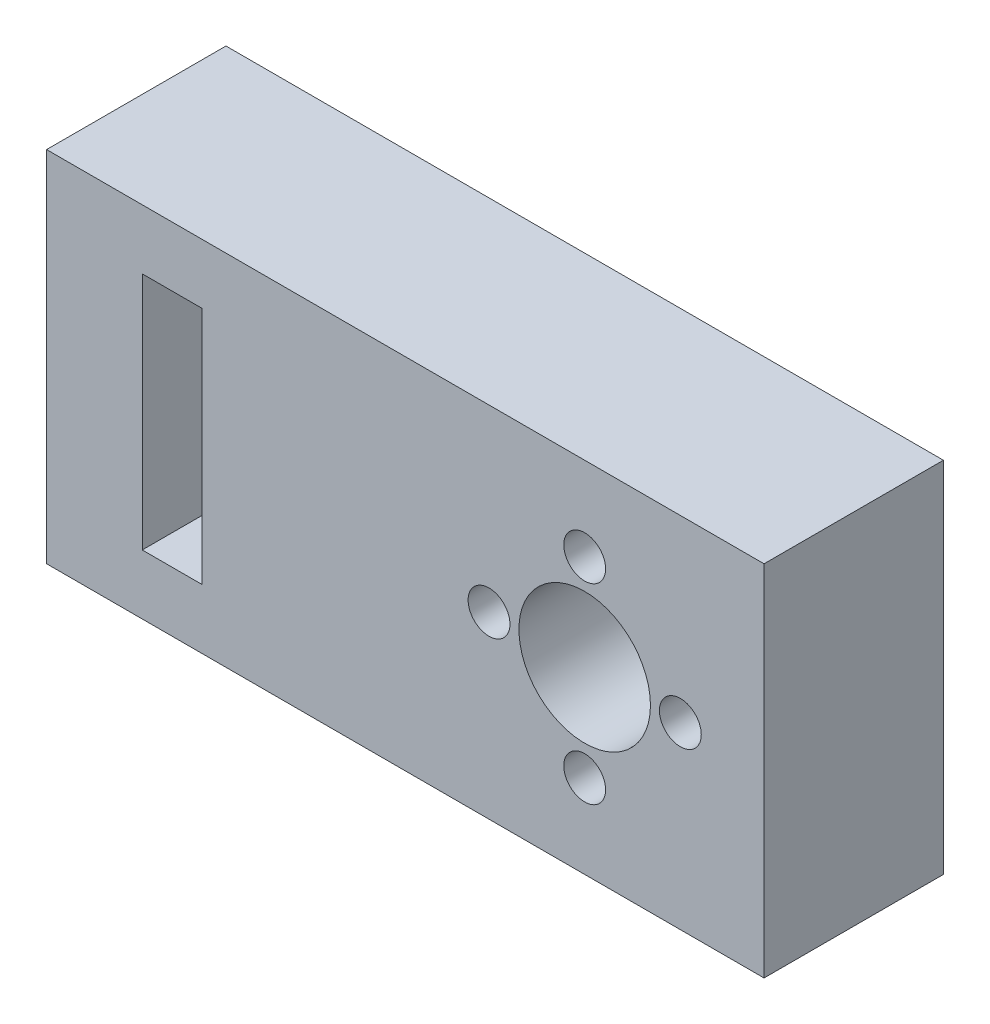
ISO-10303-21;
HEADER;
FILE_DESCRIPTION(('STEP AP214'),'2;1');
FILE_NAME('part.step','',(''),(''),'','','');
FILE_SCHEMA(('AUTOMOTIVE_DESIGN { 1 0 10303 214 1 1 1 1 }'));
ENDSEC;
DATA;
#1=APPLICATION_CONTEXT('core data for automotive mechanical design processes');
#2=APPLICATION_PROTOCOL_DEFINITION('international standard','automotive_design',2000,#1);
#3=PRODUCT_CONTEXT('',#1,'mechanical');
#4=PRODUCT('Part','Part','',(#3));
#5=PRODUCT_RELATED_PRODUCT_CATEGORY('part','',(#4));
#6=PRODUCT_DEFINITION_FORMATION('','',#4);
#7=PRODUCT_DEFINITION_CONTEXT('part definition',#1,'design');
#8=PRODUCT_DEFINITION('design','',#6,#7);
#9=PRODUCT_DEFINITION_SHAPE('','',#8);
#10=(LENGTH_UNIT() NAMED_UNIT(*) SI_UNIT(.MILLI.,.METRE.));
#11=(NAMED_UNIT(*) PLANE_ANGLE_UNIT() SI_UNIT($,.RADIAN.));
#12=(NAMED_UNIT(*) SI_UNIT($,.STERADIAN.) SOLID_ANGLE_UNIT());
#13=UNCERTAINTY_MEASURE_WITH_UNIT(LENGTH_MEASURE(1.E-05),#10,'distance_accuracy_value','');
#14=(GEOMETRIC_REPRESENTATION_CONTEXT(3) GLOBAL_UNCERTAINTY_ASSIGNED_CONTEXT((#13)) GLOBAL_UNIT_ASSIGNED_CONTEXT((#10,
#11,#12)) REPRESENTATION_CONTEXT('',''));
#15=CARTESIAN_POINT('',(0.,0.,0.));
#16=DIRECTION('',(0.,0.,1.));
#17=DIRECTION('',(1.,0.,0.));
#18=AXIS2_PLACEMENT_3D('',#15,#16,#17);
#19=CARTESIAN_POINT('',(0.,0.,7.5));
#20=DIRECTION('',(0.,0.,1.));
#21=DIRECTION('',(1.,0.,0.));
#22=AXIS2_PLACEMENT_3D('',#19,#20,#21);
#23=PLANE('',#22);
#24=CARTESIAN_POINT('',(15.0000000000002,-8.,7.5));
#25=DIRECTION('',(0.,0.,1.));
#26=DIRECTION('',(1.,0.,0.));
#27=AXIS2_PLACEMENT_3D('',#24,#25,#26);
#28=CIRCLE('',#27,1.75);
#29=CARTESIAN_POINT('',(16.7500000000002,-8.,7.5));
#30=VERTEX_POINT('',#29);
#31=EDGE_CURVE('E274',#30,#30,#28,.T.);
#32=ORIENTED_EDGE('',*,*,#31,.F.);
#33=EDGE_LOOP('',(#32));
#34=FACE_BOUND('',#33,.T.);
#35=CARTESIAN_POINT('',(15.,8.,7.5));
#36=DIRECTION('',(0.,0.,1.));
#37=DIRECTION('',(1.,0.,0.));
#38=AXIS2_PLACEMENT_3D('',#35,#36,#37);
#39=CIRCLE('',#38,1.75);
#40=CARTESIAN_POINT('',(16.75,8.,7.5));
#41=VERTEX_POINT('',#40);
#42=EDGE_CURVE('E129',#41,#41,#39,.T.);
#43=ORIENTED_EDGE('',*,*,#42,.F.);
#44=EDGE_LOOP('',(#43));
#45=FACE_BOUND('',#44,.T.);
#46=CARTESIAN_POINT('',(15.,0.,7.5));
#47=DIRECTION('',(0.,0.,1.));
#48=DIRECTION('',(1.,0.,0.));
#49=AXIS2_PLACEMENT_3D('',#46,#47,#48);
#50=CIRCLE('',#49,5.5);
#51=CARTESIAN_POINT('',(20.5,0.,7.5));
#52=VERTEX_POINT('',#51);
#53=EDGE_CURVE('E139',#52,#52,#50,.T.);
#54=ORIENTED_EDGE('',*,*,#53,.F.);
#55=EDGE_LOOP('',(#54));
#56=FACE_BOUND('',#55,.T.);
#57=DIRECTION('',(0.,1.,0.));
#58=VECTOR('',#57,1.);
#59=CARTESIAN_POINT('',(30.,15.,7.5));
#60=LINE('',#59,#58);
#61=CARTESIAN_POINT('',(30.,-15.,7.5));
#62=VERTEX_POINT('',#61);
#63=CARTESIAN_POINT('',(30.,15.,7.5));
#64=VERTEX_POINT('',#63);
#65=EDGE_CURVE('E145',#62,#64,#60,.T.);
#66=ORIENTED_EDGE('',*,*,#65,.T.);
#67=DIRECTION('',(-1.,0.,0.));
#68=VECTOR('',#67,1.);
#69=CARTESIAN_POINT('',(-30.,15.,7.5));
#70=LINE('',#69,#68);
#71=CARTESIAN_POINT('',(-30.,15.,7.5));
#72=VERTEX_POINT('',#71);
#73=EDGE_CURVE('E148',#64,#72,#70,.T.);
#74=ORIENTED_EDGE('',*,*,#73,.T.);
#75=DIRECTION('',(0.,-1.,0.));
#76=VECTOR('',#75,1.);
#77=CARTESIAN_POINT('',(-30.,15.,7.5));
#78=LINE('',#77,#76);
#79=CARTESIAN_POINT('',(-30.,-15.,7.5));
#80=VERTEX_POINT('',#79);
#81=EDGE_CURVE('E151',#72,#80,#78,.T.);
#82=ORIENTED_EDGE('',*,*,#81,.T.);
#83=DIRECTION('',(1.,0.,0.));
#84=VECTOR('',#83,1.);
#85=CARTESIAN_POINT('',(-30.,-15.,7.5));
#86=LINE('',#85,#84);
#87=EDGE_CURVE('E153',#80,#62,#86,.T.);
#88=ORIENTED_EDGE('',*,*,#87,.T.);
#89=EDGE_LOOP('',(#66,#74,#82,#88));
#90=FACE_BOUND('',#89,.T.);
#91=DIRECTION('',(1.,0.,0.));
#92=VECTOR('',#91,1.);
#93=CARTESIAN_POINT('',(-22.,-9.99999999999999,7.5));
#94=LINE('',#93,#92);
#95=CARTESIAN_POINT('',(-22.,-9.99999999999999,7.5));
#96=VERTEX_POINT('',#95);
#97=CARTESIAN_POINT('',(-17.,-9.99999999999999,7.5));
#98=VERTEX_POINT('',#97);
#99=EDGE_CURVE('E108',#96,#98,#94,.T.);
#100=ORIENTED_EDGE('',*,*,#99,.F.);
#101=DIRECTION('',(0.,-1.,0.));
#102=VECTOR('',#101,1.);
#103=CARTESIAN_POINT('',(-22.,10.,7.5));
#104=LINE('',#103,#102);
#105=CARTESIAN_POINT('',(-22.,10.,7.5));
#106=VERTEX_POINT('',#105);
#107=EDGE_CURVE('E100',#106,#96,#104,.T.);
#108=ORIENTED_EDGE('',*,*,#107,.F.);
#109=DIRECTION('',(-1.,0.,0.));
#110=VECTOR('',#109,1.);
#111=CARTESIAN_POINT('',(-22.,10.,7.5));
#112=LINE('',#111,#110);
#113=CARTESIAN_POINT('',(-17.,10.,7.5));
#114=VERTEX_POINT('',#113);
#115=EDGE_CURVE('E123',#114,#106,#112,.T.);
#116=ORIENTED_EDGE('',*,*,#115,.F.);
#117=DIRECTION('',(0.,1.,0.));
#118=VECTOR('',#117,1.);
#119=CARTESIAN_POINT('',(-17.,10.,7.5));
#120=LINE('',#119,#118);
#121=EDGE_CURVE('E121',#98,#114,#120,.T.);
#122=ORIENTED_EDGE('',*,*,#121,.F.);
#123=EDGE_LOOP('',(#100,#108,#116,#122));
#124=FACE_BOUND('',#123,.T.);
#125=CARTESIAN_POINT('',(23.0000000000001,0.,7.5));
#126=DIRECTION('',(0.,0.,1.));
#127=DIRECTION('',(1.,0.,0.));
#128=AXIS2_PLACEMENT_3D('',#125,#126,#127);
#129=CIRCLE('',#128,1.75);
#130=CARTESIAN_POINT('',(24.7500000000001,0.,7.5));
#131=VERTEX_POINT('',#130);
#132=EDGE_CURVE('E280',#131,#131,#129,.T.);
#133=ORIENTED_EDGE('',*,*,#132,.F.);
#134=EDGE_LOOP('',(#133));
#135=FACE_BOUND('',#134,.T.);
#136=CARTESIAN_POINT('',(7.00000000000012,0.,7.5));
#137=DIRECTION('',(0.,0.,1.));
#138=DIRECTION('',(1.,0.,0.));
#139=AXIS2_PLACEMENT_3D('',#136,#137,#138);
#140=CIRCLE('',#139,1.75);
#141=CARTESIAN_POINT('',(8.75000000000012,0.,7.5));
#142=VERTEX_POINT('',#141);
#143=EDGE_CURVE('E267',#142,#142,#140,.T.);
#144=ORIENTED_EDGE('',*,*,#143,.F.);
#145=EDGE_LOOP('',(#144));
#146=FACE_BOUND('',#145,.T.);
#147=ADVANCED_FACE('F35',(#34,#45,#56,#90,#124,#135,#146),#23,.T.);
#148=CARTESIAN_POINT('',(0.,0.,-7.5));
#149=DIRECTION('',(0.,0.,1.));
#150=DIRECTION('',(1.,0.,0.));
#151=AXIS2_PLACEMENT_3D('',#148,#149,#150);
#152=PLANE('',#151);
#153=CARTESIAN_POINT('',(15.0000000000002,-8.,-7.5));
#154=DIRECTION('',(0.,0.,1.));
#155=DIRECTION('',(1.,0.,0.));
#156=AXIS2_PLACEMENT_3D('',#153,#154,#155);
#157=CIRCLE('',#156,1.75);
#158=CARTESIAN_POINT('',(16.7500000000002,-8.,-7.5));
#159=VERTEX_POINT('',#158);
#160=EDGE_CURVE('E272',#159,#159,#157,.T.);
#161=ORIENTED_EDGE('',*,*,#160,.T.);
#162=EDGE_LOOP('',(#161));
#163=FACE_BOUND('',#162,.T.);
#164=CARTESIAN_POINT('',(15.,8.,-7.5));
#165=DIRECTION('',(0.,0.,1.));
#166=DIRECTION('',(1.,0.,0.));
#167=AXIS2_PLACEMENT_3D('',#164,#165,#166);
#168=CIRCLE('',#167,1.75);
#169=CARTESIAN_POINT('',(16.75,8.,-7.5));
#170=VERTEX_POINT('',#169);
#171=EDGE_CURVE('E283',#170,#170,#168,.T.);
#172=ORIENTED_EDGE('',*,*,#171,.T.);
#173=EDGE_LOOP('',(#172));
#174=FACE_BOUND('',#173,.T.);
#175=CARTESIAN_POINT('',(15.,0.,-7.5));
#176=DIRECTION('',(0.,0.,1.));
#177=DIRECTION('',(1.,0.,0.));
#178=AXIS2_PLACEMENT_3D('',#175,#176,#177);
#179=CIRCLE('',#178,5.5);
#180=CARTESIAN_POINT('',(20.5,0.,-7.5));
#181=VERTEX_POINT('',#180);
#182=EDGE_CURVE('E116',#181,#181,#179,.T.);
#183=ORIENTED_EDGE('',*,*,#182,.T.);
#184=EDGE_LOOP('',(#183));
#185=FACE_BOUND('',#184,.T.);
#186=DIRECTION('',(0.,1.,0.));
#187=VECTOR('',#186,1.);
#188=CARTESIAN_POINT('',(30.,15.,-7.5));
#189=LINE('',#188,#187);
#190=CARTESIAN_POINT('',(30.,-15.,-7.5));
#191=VERTEX_POINT('',#190);
#192=CARTESIAN_POINT('',(30.,15.,-7.5));
#193=VERTEX_POINT('',#192);
#194=EDGE_CURVE('E142',#191,#193,#189,.T.);
#195=ORIENTED_EDGE('',*,*,#194,.F.);
#196=DIRECTION('',(1.,0.,0.));
#197=VECTOR('',#196,1.);
#198=CARTESIAN_POINT('',(-30.,-15.,-7.5));
#199=LINE('',#198,#197);
#200=CARTESIAN_POINT('',(-30.,-15.,-7.5));
#201=VERTEX_POINT('',#200);
#202=EDGE_CURVE('E149',#201,#191,#199,.T.);
#203=ORIENTED_EDGE('',*,*,#202,.F.);
#204=DIRECTION('',(0.,-1.,0.));
#205=VECTOR('',#204,1.);
#206=CARTESIAN_POINT('',(-30.,15.,-7.5));
#207=LINE('',#206,#205);
#208=CARTESIAN_POINT('',(-30.,15.,-7.5));
#209=VERTEX_POINT('',#208);
#210=EDGE_CURVE('E160',#209,#201,#207,.T.);
#211=ORIENTED_EDGE('',*,*,#210,.F.);
#212=DIRECTION('',(-1.,0.,0.));
#213=VECTOR('',#212,1.);
#214=CARTESIAN_POINT('',(-30.,15.,-7.5));
#215=LINE('',#214,#213);
#216=EDGE_CURVE('E158',#193,#209,#215,.T.);
#217=ORIENTED_EDGE('',*,*,#216,.F.);
#218=EDGE_LOOP('',(#195,#203,#211,#217));
#219=FACE_BOUND('',#218,.T.);
#220=DIRECTION('',(0.,-1.,0.));
#221=VECTOR('',#220,1.);
#222=CARTESIAN_POINT('',(-22.,10.,-7.5));
#223=LINE('',#222,#221);
#224=CARTESIAN_POINT('',(-22.,10.,-7.5));
#225=VERTEX_POINT('',#224);
#226=CARTESIAN_POINT('',(-22.,-9.99999999999999,-7.5));
#227=VERTEX_POINT('',#226);
#228=EDGE_CURVE('E58',#225,#227,#223,.T.);
#229=ORIENTED_EDGE('',*,*,#228,.T.);
#230=DIRECTION('',(1.,0.,0.));
#231=VECTOR('',#230,1.);
#232=CARTESIAN_POINT('',(-22.,-9.99999999999999,-7.5));
#233=LINE('',#232,#231);
#234=CARTESIAN_POINT('',(-17.,-9.99999999999999,-7.5));
#235=VERTEX_POINT('',#234);
#236=EDGE_CURVE('E115',#227,#235,#233,.T.);
#237=ORIENTED_EDGE('',*,*,#236,.T.);
#238=DIRECTION('',(0.,1.,0.));
#239=VECTOR('',#238,1.);
#240=CARTESIAN_POINT('',(-17.,10.,-7.5));
#241=LINE('',#240,#239);
#242=CARTESIAN_POINT('',(-17.,10.,-7.5));
#243=VERTEX_POINT('',#242);
#244=EDGE_CURVE('E131',#235,#243,#241,.T.);
#245=ORIENTED_EDGE('',*,*,#244,.T.);
#246=DIRECTION('',(-1.,0.,0.));
#247=VECTOR('',#246,1.);
#248=CARTESIAN_POINT('',(-22.,10.,-7.5));
#249=LINE('',#248,#247);
#250=EDGE_CURVE('E109',#243,#225,#249,.T.);
#251=ORIENTED_EDGE('',*,*,#250,.T.);
#252=EDGE_LOOP('',(#229,#237,#245,#251));
#253=FACE_BOUND('',#252,.T.);
#254=CARTESIAN_POINT('',(23.0000000000001,0.,-7.5));
#255=DIRECTION('',(0.,0.,1.));
#256=DIRECTION('',(1.,0.,0.));
#257=AXIS2_PLACEMENT_3D('',#254,#255,#256);
#258=CIRCLE('',#257,1.75);
#259=CARTESIAN_POINT('',(24.7500000000001,0.,-7.5));
#260=VERTEX_POINT('',#259);
#261=EDGE_CURVE('E277',#260,#260,#258,.T.);
#262=ORIENTED_EDGE('',*,*,#261,.T.);
#263=EDGE_LOOP('',(#262));
#264=FACE_BOUND('',#263,.T.);
#265=CARTESIAN_POINT('',(7.00000000000012,0.,-7.5));
#266=DIRECTION('',(0.,0.,1.));
#267=DIRECTION('',(1.,0.,0.));
#268=AXIS2_PLACEMENT_3D('',#265,#266,#267);
#269=CIRCLE('',#268,1.75);
#270=CARTESIAN_POINT('',(8.75000000000012,0.,-7.5));
#271=VERTEX_POINT('',#270);
#272=EDGE_CURVE('E264',#271,#271,#269,.T.);
#273=ORIENTED_EDGE('',*,*,#272,.T.);
#274=EDGE_LOOP('',(#273));
#275=FACE_BOUND('',#274,.T.);
#276=ADVANCED_FACE('F178',(#163,#174,#185,#219,#253,#264,#275),#152,.F.);
#277=CARTESIAN_POINT('',(30.,15.,7.5));
#278=DIRECTION('',(-1.,0.,0.));
#279=DIRECTION('',(0.,-1.,0.));
#280=AXIS2_PLACEMENT_3D('',#277,#278,#279);
#281=PLANE('',#280);
#282=ORIENTED_EDGE('',*,*,#194,.T.);
#283=DIRECTION('',(0.,0.,-1.));
#284=VECTOR('',#283,1.);
#285=CARTESIAN_POINT('',(30.,15.,7.5));
#286=LINE('',#285,#284);
#287=EDGE_CURVE('E11',#64,#193,#286,.T.);
#288=ORIENTED_EDGE('',*,*,#287,.F.);
#289=ORIENTED_EDGE('',*,*,#65,.F.);
#290=DIRECTION('',(0.,0.,-1.));
#291=VECTOR('',#290,1.);
#292=CARTESIAN_POINT('',(30.,-15.,7.5));
#293=LINE('',#292,#291);
#294=EDGE_CURVE('E155',#62,#191,#293,.T.);
#295=ORIENTED_EDGE('',*,*,#294,.T.);
#296=EDGE_LOOP('',(#282,#288,#289,#295));
#297=FACE_BOUND('',#296,.T.);
#298=ADVANCED_FACE('F37',(#297),#281,.F.);
#299=CARTESIAN_POINT('',(-30.,15.,7.5));
#300=DIRECTION('',(0.,-1.,0.));
#301=DIRECTION('',(0.,0.,-1.));
#302=AXIS2_PLACEMENT_3D('',#299,#300,#301);
#303=PLANE('',#302);
#304=ORIENTED_EDGE('',*,*,#216,.T.);
#305=DIRECTION('',(0.,0.,-1.));
#306=VECTOR('',#305,1.);
#307=CARTESIAN_POINT('',(-30.,15.,7.5));
#308=LINE('',#307,#306);
#309=EDGE_CURVE('E43',#72,#209,#308,.T.);
#310=ORIENTED_EDGE('',*,*,#309,.F.);
#311=ORIENTED_EDGE('',*,*,#73,.F.);
#312=ORIENTED_EDGE('',*,*,#287,.T.);
#313=EDGE_LOOP('',(#304,#310,#311,#312));
#314=FACE_BOUND('',#313,.T.);
#315=ADVANCED_FACE('F188',(#314),#303,.F.);
#316=CARTESIAN_POINT('',(-30.,15.,7.5));
#317=DIRECTION('',(1.,0.,0.));
#318=DIRECTION('',(0.,1.,0.));
#319=AXIS2_PLACEMENT_3D('',#316,#317,#318);
#320=PLANE('',#319);
#321=CARTESIAN_POINT('',(-30.,0.,0.));
#322=DIRECTION('',(-1.,0.,0.));
#323=DIRECTION('',(0.,-1.,0.));
#324=AXIS2_PLACEMENT_3D('',#321,#322,#323);
#325=CIRCLE('',#324,2.5);
#326=CARTESIAN_POINT('',(-30.,-2.5,0.));
#327=VERTEX_POINT('',#326);
#328=EDGE_CURVE('E261',#327,#327,#325,.T.);
#329=ORIENTED_EDGE('',*,*,#328,.F.);
#330=EDGE_LOOP('',(#329));
#331=FACE_BOUND('',#330,.T.);
#332=ORIENTED_EDGE('',*,*,#210,.T.);
#333=DIRECTION('',(0.,0.,-1.));
#334=VECTOR('',#333,1.);
#335=CARTESIAN_POINT('',(-30.,-15.,7.5));
#336=LINE('',#335,#334);
#337=EDGE_CURVE('E165',#80,#201,#336,.T.);
#338=ORIENTED_EDGE('',*,*,#337,.F.);
#339=ORIENTED_EDGE('',*,*,#81,.F.);
#340=ORIENTED_EDGE('',*,*,#309,.T.);
#341=EDGE_LOOP('',(#332,#338,#339,#340));
#342=FACE_BOUND('',#341,.T.);
#343=ADVANCED_FACE('F172',(#331,#342),#320,.F.);
#344=CARTESIAN_POINT('',(-30.,-15.,7.5));
#345=DIRECTION('',(0.,1.,0.));
#346=DIRECTION('',(0.,0.,1.));
#347=AXIS2_PLACEMENT_3D('',#344,#345,#346);
#348=PLANE('',#347);
#349=ORIENTED_EDGE('',*,*,#202,.T.);
#350=ORIENTED_EDGE('',*,*,#294,.F.);
#351=ORIENTED_EDGE('',*,*,#87,.F.);
#352=ORIENTED_EDGE('',*,*,#337,.T.);
#353=EDGE_LOOP('',(#349,#350,#351,#352));
#354=FACE_BOUND('',#353,.T.);
#355=ADVANCED_FACE('F182',(#354),#348,.F.);
#356=CARTESIAN_POINT('',(15.,0.,7.5));
#357=DIRECTION('',(0.,0.,-1.));
#358=DIRECTION('',(-1.,0.,0.));
#359=AXIS2_PLACEMENT_3D('',#356,#357,#358);
#360=CYLINDRICAL_SURFACE('',#359,5.5);
#361=ORIENTED_EDGE('',*,*,#53,.T.);
#362=EDGE_LOOP('',(#361));
#363=FACE_BOUND('',#362,.T.);
#364=ORIENTED_EDGE('',*,*,#182,.F.);
#365=EDGE_LOOP('',(#364));
#366=FACE_BOUND('',#365,.T.);
#367=ADVANCED_FACE('F207',(#363,#366),#360,.F.);
#368=CARTESIAN_POINT('',(-22.,10.,7.5));
#369=DIRECTION('',(1.,0.,0.));
#370=DIRECTION('',(0.,1.,0.));
#371=AXIS2_PLACEMENT_3D('',#368,#369,#370);
#372=PLANE('',#371);
#373=CARTESIAN_POINT('',(-22.,0.,0.));
#374=DIRECTION('',(1.,0.,0.));
#375=DIRECTION('',(0.,1.,0.));
#376=AXIS2_PLACEMENT_3D('',#373,#374,#375);
#377=CIRCLE('',#376,2.5);
#378=CARTESIAN_POINT('',(-22.,2.5,0.));
#379=VERTEX_POINT('',#378);
#380=EDGE_CURVE('E263',#379,#379,#377,.F.);
#381=ORIENTED_EDGE('',*,*,#380,.T.);
#382=EDGE_LOOP('',(#381));
#383=FACE_BOUND('',#382,.T.);
#384=ORIENTED_EDGE('',*,*,#228,.F.);
#385=DIRECTION('',(0.,0.,-1.));
#386=VECTOR('',#385,1.);
#387=CARTESIAN_POINT('',(-22.,10.,7.5));
#388=LINE('',#387,#386);
#389=EDGE_CURVE('E104',#106,#225,#388,.T.);
#390=ORIENTED_EDGE('',*,*,#389,.F.);
#391=ORIENTED_EDGE('',*,*,#107,.T.);
#392=DIRECTION('',(0.,0.,-1.));
#393=VECTOR('',#392,1.);
#394=CARTESIAN_POINT('',(-22.,-9.99999999999999,7.5));
#395=LINE('',#394,#393);
#396=EDGE_CURVE('E103',#96,#227,#395,.T.);
#397=ORIENTED_EDGE('',*,*,#396,.T.);
#398=EDGE_LOOP('',(#384,#390,#391,#397));
#399=FACE_BOUND('',#398,.T.);
#400=ADVANCED_FACE('F102',(#383,#399),#372,.T.);
#401=CARTESIAN_POINT('',(-22.,-9.99999999999999,7.5));
#402=DIRECTION('',(0.,1.,0.));
#403=DIRECTION('',(0.,0.,1.));
#404=AXIS2_PLACEMENT_3D('',#401,#402,#403);
#405=PLANE('',#404);
#406=ORIENTED_EDGE('',*,*,#236,.F.);
#407=ORIENTED_EDGE('',*,*,#396,.F.);
#408=ORIENTED_EDGE('',*,*,#99,.T.);
#409=DIRECTION('',(0.,0.,-1.));
#410=VECTOR('',#409,1.);
#411=CARTESIAN_POINT('',(-17.,-9.99999999999999,7.5));
#412=LINE('',#411,#410);
#413=EDGE_CURVE('E117',#98,#235,#412,.T.);
#414=ORIENTED_EDGE('',*,*,#413,.T.);
#415=EDGE_LOOP('',(#406,#407,#408,#414));
#416=FACE_BOUND('',#415,.T.);
#417=ADVANCED_FACE('F112',(#416),#405,.T.);
#418=CARTESIAN_POINT('',(-17.,10.,7.5));
#419=DIRECTION('',(-1.,0.,0.));
#420=DIRECTION('',(0.,-1.,0.));
#421=AXIS2_PLACEMENT_3D('',#418,#419,#420);
#422=PLANE('',#421);
#423=ORIENTED_EDGE('',*,*,#244,.F.);
#424=ORIENTED_EDGE('',*,*,#413,.F.);
#425=ORIENTED_EDGE('',*,*,#121,.T.);
#426=DIRECTION('',(0.,0.,-1.));
#427=VECTOR('',#426,1.);
#428=CARTESIAN_POINT('',(-17.,10.,7.5));
#429=LINE('',#428,#427);
#430=EDGE_CURVE('E50',#114,#243,#429,.T.);
#431=ORIENTED_EDGE('',*,*,#430,.T.);
#432=EDGE_LOOP('',(#423,#424,#425,#431));
#433=FACE_BOUND('',#432,.T.);
#434=ADVANCED_FACE('F227',(#433),#422,.T.);
#435=CARTESIAN_POINT('',(-22.,10.,7.5));
#436=DIRECTION('',(0.,-1.,0.));
#437=DIRECTION('',(0.,0.,-1.));
#438=AXIS2_PLACEMENT_3D('',#435,#436,#437);
#439=PLANE('',#438);
#440=ORIENTED_EDGE('',*,*,#250,.F.);
#441=ORIENTED_EDGE('',*,*,#430,.F.);
#442=ORIENTED_EDGE('',*,*,#115,.T.);
#443=ORIENTED_EDGE('',*,*,#389,.T.);
#444=EDGE_LOOP('',(#440,#441,#442,#443));
#445=FACE_BOUND('',#444,.T.);
#446=ADVANCED_FACE('F233',(#445),#439,.T.);
#447=CARTESIAN_POINT('',(15.,8.,7.5));
#448=DIRECTION('',(0.,0.,-1.));
#449=DIRECTION('',(-1.,0.,0.));
#450=AXIS2_PLACEMENT_3D('',#447,#448,#449);
#451=CYLINDRICAL_SURFACE('',#450,1.75);
#452=ORIENTED_EDGE('',*,*,#42,.T.);
#453=EDGE_LOOP('',(#452));
#454=FACE_BOUND('',#453,.T.);
#455=ORIENTED_EDGE('',*,*,#171,.F.);
#456=EDGE_LOOP('',(#455));
#457=FACE_BOUND('',#456,.T.);
#458=ADVANCED_FACE('F237',(#454,#457),#451,.F.);
#459=CARTESIAN_POINT('',(23.0000000000001,0.,7.5));
#460=DIRECTION('',(0.,0.,-1.));
#461=DIRECTION('',(-1.,0.,0.));
#462=AXIS2_PLACEMENT_3D('',#459,#460,#461);
#463=CYLINDRICAL_SURFACE('',#462,1.75);
#464=ORIENTED_EDGE('',*,*,#132,.T.);
#465=EDGE_LOOP('',(#464));
#466=FACE_BOUND('',#465,.T.);
#467=ORIENTED_EDGE('',*,*,#261,.F.);
#468=EDGE_LOOP('',(#467));
#469=FACE_BOUND('',#468,.T.);
#470=ADVANCED_FACE('F240',(#466,#469),#463,.F.);
#471=CARTESIAN_POINT('',(15.0000000000002,-8.,7.5));
#472=DIRECTION('',(0.,0.,-1.));
#473=DIRECTION('',(-1.,0.,0.));
#474=AXIS2_PLACEMENT_3D('',#471,#472,#473);
#475=CYLINDRICAL_SURFACE('',#474,1.75);
#476=ORIENTED_EDGE('',*,*,#31,.T.);
#477=EDGE_LOOP('',(#476));
#478=FACE_BOUND('',#477,.T.);
#479=ORIENTED_EDGE('',*,*,#160,.F.);
#480=EDGE_LOOP('',(#479));
#481=FACE_BOUND('',#480,.T.);
#482=ADVANCED_FACE('F244',(#478,#481),#475,.F.);
#483=CARTESIAN_POINT('',(7.00000000000012,0.,7.5));
#484=DIRECTION('',(0.,0.,-1.));
#485=DIRECTION('',(-1.,0.,0.));
#486=AXIS2_PLACEMENT_3D('',#483,#484,#485);
#487=CYLINDRICAL_SURFACE('',#486,1.75);
#488=ORIENTED_EDGE('',*,*,#143,.T.);
#489=EDGE_LOOP('',(#488));
#490=FACE_BOUND('',#489,.T.);
#491=ORIENTED_EDGE('',*,*,#272,.F.);
#492=EDGE_LOOP('',(#491));
#493=FACE_BOUND('',#492,.T.);
#494=ADVANCED_FACE('F248',(#490,#493),#487,.F.);
#495=CARTESIAN_POINT('',(-14.9289321881345,0.,0.));
#496=DIRECTION('',(-1.,0.,0.));
#497=DIRECTION('',(0.,-1.,0.));
#498=AXIS2_PLACEMENT_3D('',#495,#496,#497);
#499=CYLINDRICAL_SURFACE('',#498,2.5);
#500=ORIENTED_EDGE('',*,*,#328,.T.);
#501=EDGE_LOOP('',(#500));
#502=FACE_BOUND('',#501,.T.);
#503=ORIENTED_EDGE('',*,*,#380,.F.);
#504=EDGE_LOOP('',(#503));
#505=FACE_BOUND('',#504,.T.);
#506=ADVANCED_FACE('F252',(#502,#505),#499,.F.);
#507=CLOSED_SHELL('',(#147,#276,#298,#315,#343,#355,#367,#400,#417,#434,#446,#458,#470,#482,
#494,#506));
#508=MANIFOLD_SOLID_BREP('B2',#507);
#509=ADVANCED_BREP_SHAPE_REPRESENTATION('',(#18,#508),#14);
#510=SHAPE_DEFINITION_REPRESENTATION(#9,#509);
ENDSEC;
END-ISO-10303-21;
